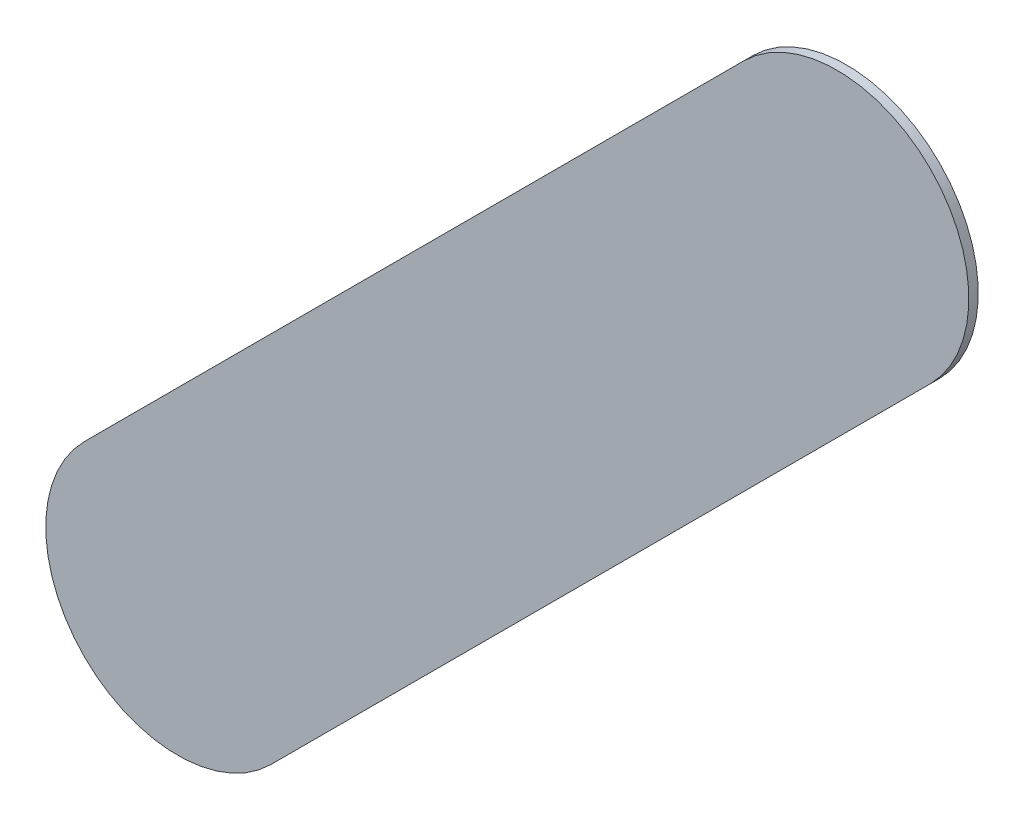
ISO-10303-21;
HEADER;
FILE_DESCRIPTION(('STEP AP214'),'2;1');
FILE_NAME('part.step','',(''),(''),'','','');
FILE_SCHEMA(('AUTOMOTIVE_DESIGN { 1 0 10303 214 1 1 1 1 }'));
ENDSEC;
DATA;
#1=APPLICATION_CONTEXT('core data for automotive mechanical design processes');
#2=APPLICATION_PROTOCOL_DEFINITION('international standard','automotive_design',2000,#1);
#3=PRODUCT_CONTEXT('',#1,'mechanical');
#4=PRODUCT('Part','Part','',(#3));
#5=PRODUCT_RELATED_PRODUCT_CATEGORY('part','',(#4));
#6=PRODUCT_DEFINITION_FORMATION('','',#4);
#7=PRODUCT_DEFINITION_CONTEXT('part definition',#1,'design');
#8=PRODUCT_DEFINITION('design','',#6,#7);
#9=PRODUCT_DEFINITION_SHAPE('','',#8);
#10=(LENGTH_UNIT() NAMED_UNIT(*) SI_UNIT(.MILLI.,.METRE.));
#11=(NAMED_UNIT(*) PLANE_ANGLE_UNIT() SI_UNIT($,.RADIAN.));
#12=(NAMED_UNIT(*) SI_UNIT($,.STERADIAN.) SOLID_ANGLE_UNIT());
#13=UNCERTAINTY_MEASURE_WITH_UNIT(LENGTH_MEASURE(1.E-05),#10,'distance_accuracy_value','');
#14=(GEOMETRIC_REPRESENTATION_CONTEXT(3) GLOBAL_UNCERTAINTY_ASSIGNED_CONTEXT((#13)) GLOBAL_UNIT_ASSIGNED_CONTEXT((#10,
#11,#12)) REPRESENTATION_CONTEXT('',''));
#15=CARTESIAN_POINT('',(0.,0.,0.));
#16=DIRECTION('',(0.,0.,1.));
#17=DIRECTION('',(1.,0.,0.));
#18=AXIS2_PLACEMENT_3D('',#15,#16,#17);
#19=CARTESIAN_POINT('',(40.2535517,76.14644664,0.));
#20=DIRECTION('',(-0.70710678118655,0.707106781186546,0.));
#21=DIRECTION('',(0.707106781186546,0.70710678118655,0.));
#22=AXIS2_PLACEMENT_3D('',#19,#20,#21);
#23=PLANE('',#22);
#24=DIRECTION('',(0.707106781186546,0.70710678118655,0.));
#25=VECTOR('',#24,1.);
#26=CARTESIAN_POINT('',(40.2535517,76.14644664,0.03556));
#27=LINE('',#26,#25);
#28=CARTESIAN_POINT('',(40.2535517,76.14644664,0.03556));
#29=VERTEX_POINT('',#28);
#30=CARTESIAN_POINT('',(42.75355178,78.64644672,0.03556));
#31=VERTEX_POINT('',#30);
#32=EDGE_CURVE('E11',#29,#31,#27,.T.);
#33=ORIENTED_EDGE('',*,*,#32,.F.);
#34=DIRECTION('',(0.,0.,1.));
#35=VECTOR('',#34,1.);
#36=CARTESIAN_POINT('',(40.2535517,76.14644664,0.));
#37=LINE('',#36,#35);
#38=CARTESIAN_POINT('',(40.2535517,76.14644664,0.));
#39=VERTEX_POINT('',#38);
#40=EDGE_CURVE('E24',#39,#29,#37,.T.);
#41=ORIENTED_EDGE('',*,*,#40,.F.);
#42=DIRECTION('',(0.707106781186546,0.70710678118655,0.));
#43=VECTOR('',#42,1.);
#44=CARTESIAN_POINT('',(40.2535517,76.14644664,0.));
#45=LINE('',#44,#43);
#46=CARTESIAN_POINT('',(42.75355178,78.64644672,0.));
#47=VERTEX_POINT('',#46);
#48=EDGE_CURVE('E75',#39,#47,#45,.T.);
#49=ORIENTED_EDGE('',*,*,#48,.T.);
#50=DIRECTION('',(0.,0.,1.));
#51=VECTOR('',#50,1.);
#52=CARTESIAN_POINT('',(42.75355178,78.64644672,0.));
#53=LINE('',#52,#51);
#54=EDGE_CURVE('E37',#47,#31,#53,.T.);
#55=ORIENTED_EDGE('',*,*,#54,.T.);
#56=EDGE_LOOP('',(#33,#41,#49,#55));
#57=FACE_BOUND('',#56,.T.);
#58=ADVANCED_FACE('F17',(#57),#23,.F.);
#59=CARTESIAN_POINT('',(42.39999902,78.99999948,0.));
#60=DIRECTION('',(0.,0.,-1.));
#61=DIRECTION('',(0.707106781186548,-0.707106781186548,0.));
#62=AXIS2_PLACEMENT_3D('',#59,#60,#61);
#63=CYLINDRICAL_SURFACE('',#62,0.499999108206439);
#64=CARTESIAN_POINT('',(42.39999902,78.99999948,0.03556));
#65=DIRECTION('',(0.,0.,1.));
#66=DIRECTION('',(0.707106781186548,-0.707106781186548,0.));
#67=AXIS2_PLACEMENT_3D('',#64,#65,#66);
#68=CIRCLE('',#67,0.499999108206439);
#69=CARTESIAN_POINT('',(42.04644626,79.35355224,0.03556));
#70=VERTEX_POINT('',#69);
#71=EDGE_CURVE('E83',#31,#70,#68,.T.);
#72=ORIENTED_EDGE('',*,*,#71,.F.);
#73=ORIENTED_EDGE('',*,*,#54,.F.);
#74=CARTESIAN_POINT('',(42.39999902,78.99999948,0.));
#75=DIRECTION('',(0.,0.,1.));
#76=DIRECTION('',(0.707106781186548,-0.707106781186548,0.));
#77=AXIS2_PLACEMENT_3D('',#74,#75,#76);
#78=CIRCLE('',#77,0.499999108206439);
#79=CARTESIAN_POINT('',(42.04644626,79.35355224,0.));
#80=VERTEX_POINT('',#79);
#81=EDGE_CURVE('E81',#47,#80,#78,.T.);
#82=ORIENTED_EDGE('',*,*,#81,.T.);
#83=DIRECTION('',(0.,0.,1.));
#84=VECTOR('',#83,1.);
#85=CARTESIAN_POINT('',(42.04644626,79.35355224,0.));
#86=LINE('',#85,#84);
#87=EDGE_CURVE('E67',#80,#70,#86,.T.);
#88=ORIENTED_EDGE('',*,*,#87,.T.);
#89=EDGE_LOOP('',(#72,#73,#82,#88));
#90=FACE_BOUND('',#89,.T.);
#91=ADVANCED_FACE('F89',(#90),#63,.T.);
#92=CARTESIAN_POINT('',(42.04644626,79.35355224,0.));
#93=DIRECTION('',(0.707106781186549,-0.707106781186547,0.));
#94=DIRECTION('',(-0.707106781186547,-0.707106781186549,0.));
#95=AXIS2_PLACEMENT_3D('',#92,#93,#94);
#96=PLANE('',#95);
#97=DIRECTION('',(-0.707106781186547,-0.707106781186549,0.));
#98=VECTOR('',#97,1.);
#99=CARTESIAN_POINT('',(42.04644626,79.35355224,0.03556));
#100=LINE('',#99,#98);
#101=CARTESIAN_POINT('',(39.54644618,76.85355216,0.03556));
#102=VERTEX_POINT('',#101);
#103=EDGE_CURVE('E71',#70,#102,#100,.T.);
#104=ORIENTED_EDGE('',*,*,#103,.F.);
#105=ORIENTED_EDGE('',*,*,#87,.F.);
#106=DIRECTION('',(-0.707106781186547,-0.707106781186549,0.));
#107=VECTOR('',#106,1.);
#108=CARTESIAN_POINT('',(42.04644626,79.35355224,0.));
#109=LINE('',#108,#107);
#110=CARTESIAN_POINT('',(39.54644618,76.85355216,0.));
#111=VERTEX_POINT('',#110);
#112=EDGE_CURVE('E63',#80,#111,#109,.T.);
#113=ORIENTED_EDGE('',*,*,#112,.T.);
#114=DIRECTION('',(0.,0.,1.));
#115=VECTOR('',#114,1.);
#116=CARTESIAN_POINT('',(39.54644618,76.85355216,0.));
#117=LINE('',#116,#115);
#118=EDGE_CURVE('E53',#111,#102,#117,.T.);
#119=ORIENTED_EDGE('',*,*,#118,.T.);
#120=EDGE_LOOP('',(#104,#105,#113,#119));
#121=FACE_BOUND('',#120,.T.);
#122=ADVANCED_FACE('F66',(#121),#96,.F.);
#123=CARTESIAN_POINT('',(39.89999894,76.4999994,0.));
#124=DIRECTION('',(0.,0.,-1.));
#125=DIRECTION('',(-0.707106781186555,0.70710678118654,0.));
#126=AXIS2_PLACEMENT_3D('',#123,#124,#125);
#127=CYLINDRICAL_SURFACE('',#126,0.499999108206442);
#128=CARTESIAN_POINT('',(39.89999894,76.4999994,0.03556));
#129=DIRECTION('',(0.,0.,1.));
#130=DIRECTION('',(-0.707106781186555,0.70710678118654,0.));
#131=AXIS2_PLACEMENT_3D('',#128,#129,#130);
#132=CIRCLE('',#131,0.499999108206442);
#133=EDGE_CURVE('E59',#102,#29,#132,.T.);
#134=ORIENTED_EDGE('',*,*,#133,.F.);
#135=ORIENTED_EDGE('',*,*,#118,.F.);
#136=CARTESIAN_POINT('',(39.89999894,76.4999994,0.));
#137=DIRECTION('',(0.,0.,1.));
#138=DIRECTION('',(-0.707106781186555,0.70710678118654,0.));
#139=AXIS2_PLACEMENT_3D('',#136,#137,#138);
#140=CIRCLE('',#139,0.499999108206442);
#141=EDGE_CURVE('E57',#111,#39,#140,.T.);
#142=ORIENTED_EDGE('',*,*,#141,.T.);
#143=ORIENTED_EDGE('',*,*,#40,.T.);
#144=EDGE_LOOP('',(#134,#135,#142,#143));
#145=FACE_BOUND('',#144,.T.);
#146=ADVANCED_FACE('F55',(#145),#127,.T.);
#147=CARTESIAN_POINT('',(40.2535517,76.14644664,0.));
#148=DIRECTION('',(0.,0.,-1.));
#149=DIRECTION('',(-1.,0.,0.));
#150=AXIS2_PLACEMENT_3D('',#147,#148,#149);
#151=PLANE('',#150);
#152=ORIENTED_EDGE('',*,*,#141,.F.);
#153=ORIENTED_EDGE('',*,*,#112,.F.);
#154=ORIENTED_EDGE('',*,*,#81,.F.);
#155=ORIENTED_EDGE('',*,*,#48,.F.);
#156=EDGE_LOOP('',(#152,#153,#154,#155));
#157=FACE_BOUND('',#156,.T.);
#158=ADVANCED_FACE('F74',(#157),#151,.T.);
#159=CARTESIAN_POINT('',(40.2535517,76.14644664,0.03556));
#160=DIRECTION('',(0.,0.,-1.));
#161=DIRECTION('',(-1.,0.,0.));
#162=AXIS2_PLACEMENT_3D('',#159,#160,#161);
#163=PLANE('',#162);
#164=ORIENTED_EDGE('',*,*,#32,.T.);
#165=ORIENTED_EDGE('',*,*,#71,.T.);
#166=ORIENTED_EDGE('',*,*,#103,.T.);
#167=ORIENTED_EDGE('',*,*,#133,.T.);
#168=EDGE_LOOP('',(#164,#165,#166,#167));
#169=FACE_BOUND('',#168,.T.);
#170=ADVANCED_FACE('F91',(#169),#163,.F.);
#171=CLOSED_SHELL('',(#58,#91,#122,#146,#158,#170));
#172=MANIFOLD_SOLID_BREP('B1',#171);
#173=ADVANCED_BREP_SHAPE_REPRESENTATION('',(#18,#172),#14);
#174=SHAPE_DEFINITION_REPRESENTATION(#9,#173);
ENDSEC;
END-ISO-10303-21;
